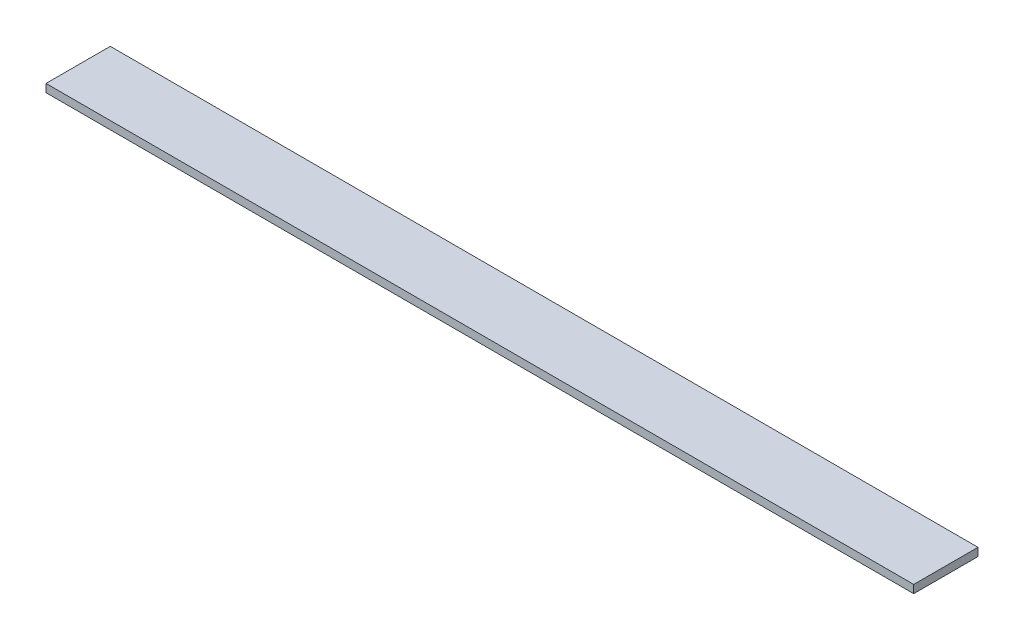
ISO-10303-21;
HEADER;
FILE_DESCRIPTION(('STEP AP214'),'2;1');
FILE_NAME('part.step','',(''),(''),'','','');
FILE_SCHEMA(('AUTOMOTIVE_DESIGN { 1 0 10303 214 1 1 1 1 }'));
ENDSEC;
DATA;
#1=APPLICATION_CONTEXT('core data for automotive mechanical design processes');
#2=APPLICATION_PROTOCOL_DEFINITION('international standard','automotive_design',2000,#1);
#3=PRODUCT_CONTEXT('',#1,'mechanical');
#4=PRODUCT('Part','Part','',(#3));
#5=PRODUCT_RELATED_PRODUCT_CATEGORY('part','',(#4));
#6=PRODUCT_DEFINITION_FORMATION('','',#4);
#7=PRODUCT_DEFINITION_CONTEXT('part definition',#1,'design');
#8=PRODUCT_DEFINITION('design','',#6,#7);
#9=PRODUCT_DEFINITION_SHAPE('','',#8);
#10=(LENGTH_UNIT() NAMED_UNIT(*) SI_UNIT(.MILLI.,.METRE.));
#11=(NAMED_UNIT(*) PLANE_ANGLE_UNIT() SI_UNIT($,.RADIAN.));
#12=(NAMED_UNIT(*) SI_UNIT($,.STERADIAN.) SOLID_ANGLE_UNIT());
#13=UNCERTAINTY_MEASURE_WITH_UNIT(LENGTH_MEASURE(1.E-05),#10,'distance_accuracy_value','');
#14=(GEOMETRIC_REPRESENTATION_CONTEXT(3) GLOBAL_UNCERTAINTY_ASSIGNED_CONTEXT((#13)) GLOBAL_UNIT_ASSIGNED_CONTEXT((#10,
#11,#12)) REPRESENTATION_CONTEXT('',''));
#15=CARTESIAN_POINT('',(0.,0.,0.));
#16=DIRECTION('',(0.,0.,1.));
#17=DIRECTION('',(1.,0.,0.));
#18=AXIS2_PLACEMENT_3D('',#15,#16,#17);
#19=CARTESIAN_POINT('',(-74.7636363636363,1.,-1.12727272727273));
#20=DIRECTION('',(1.,0.,0.));
#21=DIRECTION('',(0.,0.,-1.));
#22=AXIS2_PLACEMENT_3D('',#19,#20,#21);
#23=PLANE('',#22);
#24=DIRECTION('',(0.,0.,1.));
#25=VECTOR('',#24,1.);
#26=CARTESIAN_POINT('',(-74.7636363636363,0.,-1.12727272727273));
#27=LINE('',#26,#25);
#28=CARTESIAN_POINT('',(-74.7636363636363,0.,-1.12727272727273));
#29=VERTEX_POINT('',#28);
#30=CARTESIAN_POINT('',(-74.7636363636363,0.,6.87272727272727));
#31=VERTEX_POINT('',#30);
#32=EDGE_CURVE('E107',#29,#31,#27,.T.);
#33=ORIENTED_EDGE('',*,*,#32,.T.);
#34=DIRECTION('',(0.,-1.,0.));
#35=VECTOR('',#34,1.);
#36=CARTESIAN_POINT('',(-74.7636363636363,1.,6.87272727272727));
#37=LINE('',#36,#35);
#38=CARTESIAN_POINT('',(-74.7636363636363,1.,6.87272727272727));
#39=VERTEX_POINT('',#38);
#40=EDGE_CURVE('E11',#39,#31,#37,.T.);
#41=ORIENTED_EDGE('',*,*,#40,.F.);
#42=DIRECTION('',(0.,0.,1.));
#43=VECTOR('',#42,1.);
#44=CARTESIAN_POINT('',(-74.7636363636363,1.,-1.12727272727273));
#45=LINE('',#44,#43);
#46=CARTESIAN_POINT('',(-74.7636363636363,1.,-1.12727272727273));
#47=VERTEX_POINT('',#46);
#48=EDGE_CURVE('E91',#47,#39,#45,.T.);
#49=ORIENTED_EDGE('',*,*,#48,.F.);
#50=DIRECTION('',(0.,-1.,0.));
#51=VECTOR('',#50,1.);
#52=CARTESIAN_POINT('',(-74.7636363636363,1.,-1.12727272727273));
#53=LINE('',#52,#51);
#54=EDGE_CURVE('E103',#47,#29,#53,.T.);
#55=ORIENTED_EDGE('',*,*,#54,.T.);
#56=EDGE_LOOP('',(#33,#41,#49,#55));
#57=FACE_BOUND('',#56,.T.);
#58=ADVANCED_FACE('F39',(#57),#23,.F.);
#59=CARTESIAN_POINT('',(-74.7636363636363,1.,6.87272727272727));
#60=DIRECTION('',(0.,0.,-1.));
#61=DIRECTION('',(-1.,0.,0.));
#62=AXIS2_PLACEMENT_3D('',#59,#60,#61);
#63=PLANE('',#62);
#64=DIRECTION('',(1.,0.,0.));
#65=VECTOR('',#64,1.);
#66=CARTESIAN_POINT('',(-74.7636363636363,0.,6.87272727272727));
#67=LINE('',#66,#65);
#68=CARTESIAN_POINT('',(33.2363636363637,0.,6.87272727272727));
#69=VERTEX_POINT('',#68);
#70=EDGE_CURVE('E96',#31,#69,#67,.T.);
#71=ORIENTED_EDGE('',*,*,#70,.T.);
#72=DIRECTION('',(0.,-1.,0.));
#73=VECTOR('',#72,1.);
#74=CARTESIAN_POINT('',(33.2363636363637,1.,6.87272727272727));
#75=LINE('',#74,#73);
#76=CARTESIAN_POINT('',(33.2363636363637,1.,6.87272727272727));
#77=VERTEX_POINT('',#76);
#78=EDGE_CURVE('E48',#77,#69,#75,.T.);
#79=ORIENTED_EDGE('',*,*,#78,.F.);
#80=DIRECTION('',(1.,0.,0.));
#81=VECTOR('',#80,1.);
#82=CARTESIAN_POINT('',(-74.7636363636363,1.,6.87272727272727));
#83=LINE('',#82,#81);
#84=EDGE_CURVE('E86',#39,#77,#83,.T.);
#85=ORIENTED_EDGE('',*,*,#84,.F.);
#86=ORIENTED_EDGE('',*,*,#40,.T.);
#87=EDGE_LOOP('',(#71,#79,#85,#86));
#88=FACE_BOUND('',#87,.T.);
#89=ADVANCED_FACE('F95',(#88),#63,.F.);
#90=CARTESIAN_POINT('',(33.2363636363637,1.,-1.12727272727273));
#91=DIRECTION('',(-1.,0.,0.));
#92=DIRECTION('',(0.,0.,1.));
#93=AXIS2_PLACEMENT_3D('',#90,#91,#92);
#94=PLANE('',#93);
#95=DIRECTION('',(0.,0.,-1.));
#96=VECTOR('',#95,1.);
#97=CARTESIAN_POINT('',(33.2363636363637,0.,-1.12727272727273));
#98=LINE('',#97,#96);
#99=CARTESIAN_POINT('',(33.2363636363637,0.,-1.12727272727273));
#100=VERTEX_POINT('',#99);
#101=EDGE_CURVE('E73',#69,#100,#98,.T.);
#102=ORIENTED_EDGE('',*,*,#101,.T.);
#103=DIRECTION('',(0.,-1.,0.));
#104=VECTOR('',#103,1.);
#105=CARTESIAN_POINT('',(33.2363636363637,1.,-1.12727272727273));
#106=LINE('',#105,#104);
#107=CARTESIAN_POINT('',(33.2363636363637,1.,-1.12727272727273));
#108=VERTEX_POINT('',#107);
#109=EDGE_CURVE('E98',#108,#100,#106,.T.);
#110=ORIENTED_EDGE('',*,*,#109,.F.);
#111=DIRECTION('',(0.,0.,-1.));
#112=VECTOR('',#111,1.);
#113=CARTESIAN_POINT('',(33.2363636363637,1.,-1.12727272727273));
#114=LINE('',#113,#112);
#115=EDGE_CURVE('E89',#77,#108,#114,.T.);
#116=ORIENTED_EDGE('',*,*,#115,.F.);
#117=ORIENTED_EDGE('',*,*,#78,.T.);
#118=EDGE_LOOP('',(#102,#110,#116,#117));
#119=FACE_BOUND('',#118,.T.);
#120=ADVANCED_FACE('F99',(#119),#94,.F.);
#121=CARTESIAN_POINT('',(-74.7636363636363,1.,-1.12727272727273));
#122=DIRECTION('',(0.,0.,1.));
#123=DIRECTION('',(1.,0.,0.));
#124=AXIS2_PLACEMENT_3D('',#121,#122,#123);
#125=PLANE('',#124);
#126=DIRECTION('',(-1.,0.,0.));
#127=VECTOR('',#126,1.);
#128=CARTESIAN_POINT('',(-74.7636363636363,0.,-1.12727272727273));
#129=LINE('',#128,#127);
#130=EDGE_CURVE('E79',#100,#29,#129,.T.);
#131=ORIENTED_EDGE('',*,*,#130,.T.);
#132=ORIENTED_EDGE('',*,*,#54,.F.);
#133=DIRECTION('',(-1.,0.,0.));
#134=VECTOR('',#133,1.);
#135=CARTESIAN_POINT('',(-74.7636363636363,1.,-1.12727272727273));
#136=LINE('',#135,#134);
#137=EDGE_CURVE('E56',#108,#47,#136,.T.);
#138=ORIENTED_EDGE('',*,*,#137,.F.);
#139=ORIENTED_EDGE('',*,*,#109,.T.);
#140=EDGE_LOOP('',(#131,#132,#138,#139));
#141=FACE_BOUND('',#140,.T.);
#142=ADVANCED_FACE('F120',(#141),#125,.F.);
#143=CARTESIAN_POINT('',(0.,1.,0.));
#144=DIRECTION('',(0.,1.,0.));
#145=DIRECTION('',(0.,0.,1.));
#146=AXIS2_PLACEMENT_3D('',#143,#144,#145);
#147=PLANE('',#146);
#148=ORIENTED_EDGE('',*,*,#48,.T.);
#149=ORIENTED_EDGE('',*,*,#84,.T.);
#150=ORIENTED_EDGE('',*,*,#115,.T.);
#151=ORIENTED_EDGE('',*,*,#137,.T.);
#152=EDGE_LOOP('',(#148,#149,#150,#151));
#153=FACE_BOUND('',#152,.T.);
#154=ADVANCED_FACE('F87',(#153),#147,.T.);
#155=CARTESIAN_POINT('',(0.,0.,0.));
#156=DIRECTION('',(0.,1.,0.));
#157=DIRECTION('',(0.,0.,1.));
#158=AXIS2_PLACEMENT_3D('',#155,#156,#157);
#159=PLANE('',#158);
#160=ORIENTED_EDGE('',*,*,#32,.F.);
#161=ORIENTED_EDGE('',*,*,#130,.F.);
#162=ORIENTED_EDGE('',*,*,#101,.F.);
#163=ORIENTED_EDGE('',*,*,#70,.F.);
#164=EDGE_LOOP('',(#160,#161,#162,#163));
#165=FACE_BOUND('',#164,.T.);
#166=ADVANCED_FACE('F123',(#165),#159,.F.);
#167=CLOSED_SHELL('',(#58,#89,#120,#142,#154,#166));
#168=MANIFOLD_SOLID_BREP('B2',#167);
#169=ADVANCED_BREP_SHAPE_REPRESENTATION('',(#18,#168),#14);
#170=SHAPE_DEFINITION_REPRESENTATION(#9,#169);
ENDSEC;
END-ISO-10303-21;
